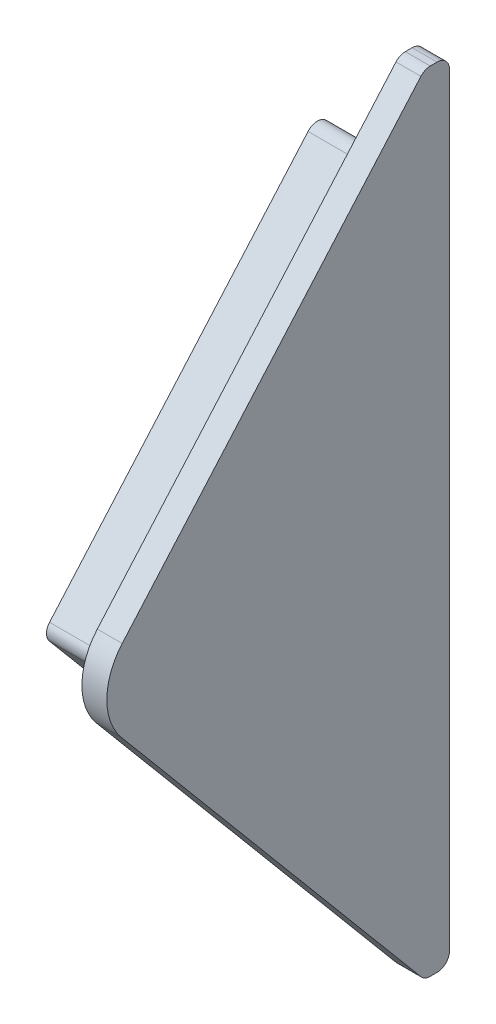
ISO-10303-21;
HEADER;
FILE_DESCRIPTION(('STEP AP214'),'2;1');
FILE_NAME('part.step','',(''),(''),'','','');
FILE_SCHEMA(('AUTOMOTIVE_DESIGN { 1 0 10303 214 1 1 1 1 }'));
ENDSEC;
DATA;
#1=APPLICATION_CONTEXT('core data for automotive mechanical design processes');
#2=APPLICATION_PROTOCOL_DEFINITION('international standard','automotive_design',2000,#1);
#3=PRODUCT_CONTEXT('',#1,'mechanical');
#4=PRODUCT('Part','Part','',(#3));
#5=PRODUCT_RELATED_PRODUCT_CATEGORY('part','',(#4));
#6=PRODUCT_DEFINITION_FORMATION('','',#4);
#7=PRODUCT_DEFINITION_CONTEXT('part definition',#1,'design');
#8=PRODUCT_DEFINITION('design','',#6,#7);
#9=PRODUCT_DEFINITION_SHAPE('','',#8);
#10=(LENGTH_UNIT() NAMED_UNIT(*) SI_UNIT(.MILLI.,.METRE.));
#11=(NAMED_UNIT(*) PLANE_ANGLE_UNIT() SI_UNIT($,.RADIAN.));
#12=(NAMED_UNIT(*) SI_UNIT($,.STERADIAN.) SOLID_ANGLE_UNIT());
#13=UNCERTAINTY_MEASURE_WITH_UNIT(LENGTH_MEASURE(1.E-05),#10,'distance_accuracy_value','');
#14=(GEOMETRIC_REPRESENTATION_CONTEXT(3) GLOBAL_UNCERTAINTY_ASSIGNED_CONTEXT((#13)) GLOBAL_UNIT_ASSIGNED_CONTEXT((#10,
#11,#12)) REPRESENTATION_CONTEXT('',''));
#15=CARTESIAN_POINT('',(0.,0.,0.));
#16=DIRECTION('',(0.,0.,1.));
#17=DIRECTION('',(1.,0.,0.));
#18=AXIS2_PLACEMENT_3D('',#15,#16,#17);
#19=CARTESIAN_POINT('',(-5.,1.67124778518499,-1.99171555210935));
#20=DIRECTION('',(0.,-0.642787609686535,0.766044443118982));
#21=DIRECTION('',(0.,-0.766044443118982,-0.642787609686535));
#22=AXIS2_PLACEMENT_3D('',#19,#20,#21);
#23=PLANE('',#22);
#24=DIRECTION('',(0.,-0.766044443118982,-0.642787609686535));
#25=VECTOR('',#24,1.);
#26=CARTESIAN_POINT('',(-5.,1.67124778518499,-1.99171555210935));
#27=LINE('',#26,#25);
#28=CARTESIAN_POINT('',(-5.,31.5898475942284,23.1129705129993));
#29=VERTEX_POINT('',#28);
#30=CARTESIAN_POINT('',(-5.,6.86462391516174,2.36604444311898));
#31=VERTEX_POINT('',#30);
#32=EDGE_CURVE('E210',#29,#31,#27,.T.);
#33=ORIENTED_EDGE('',*,*,#32,.T.);
#34=DIRECTION('',(1.,0.,0.));
#35=VECTOR('',#34,1.);
#36=CARTESIAN_POINT('',(-5.,6.86462391516174,2.36604444311898));
#37=LINE('',#36,#35);
#38=CARTESIAN_POINT('',(0.,6.86462391516174,2.36604444311898));
#39=VERTEX_POINT('',#38);
#40=EDGE_CURVE('E241',#31,#39,#37,.T.);
#41=ORIENTED_EDGE('',*,*,#40,.T.);
#42=DIRECTION('',(0.,-0.766044443118982,-0.642787609686535));
#43=VECTOR('',#42,1.);
#44=CARTESIAN_POINT('',(0.,1.67124778518499,-1.99171555210935));
#45=LINE('',#44,#43);
#46=CARTESIAN_POINT('',(0.,31.5898475942284,23.1129705129993));
#47=VERTEX_POINT('',#46);
#48=EDGE_CURVE('E222',#47,#39,#45,.T.);
#49=ORIENTED_EDGE('',*,*,#48,.F.);
#50=DIRECTION('',(1.,0.,0.));
#51=VECTOR('',#50,1.);
#52=CARTESIAN_POINT('',(-5.,31.5898475942284,23.1129705129993));
#53=LINE('',#52,#51);
#54=EDGE_CURVE('E238',#47,#29,#53,.F.);
#55=ORIENTED_EDGE('',*,*,#54,.T.);
#56=EDGE_LOOP('',(#33,#41,#49,#55));
#57=FACE_BOUND('',#56,.T.);
#58=ADVANCED_FACE('F47',(#57),#23,.T.);
#59=CARTESIAN_POINT('',(-5.,25.6847211739515,29.3960849054822));
#60=DIRECTION('',(0.,0.657969745780061,0.753044363658691));
#61=DIRECTION('',(0.,-0.753044363658691,0.657969745780061));
#62=AXIS2_PLACEMENT_3D('',#59,#60,#61);
#63=PLANE('',#62);
#64=DIRECTION('',(0.,-0.753044363658691,0.657969745780061));
#65=VECTOR('',#64,1.);
#66=CARTESIAN_POINT('',(0.,25.6847211739515,29.3960849054822));
#67=LINE('',#66,#65);
#68=CARTESIAN_POINT('',(0.,56.6353984457008,2.35304436365869));
#69=VERTEX_POINT('',#68);
#70=CARTESIAN_POINT('',(0.,32.890604949695,23.0999704335391));
#71=VERTEX_POINT('',#70);
#72=EDGE_CURVE('E215',#69,#71,#67,.T.);
#73=ORIENTED_EDGE('',*,*,#72,.F.);
#74=DIRECTION('',(1.,0.,0.));
#75=VECTOR('',#74,1.);
#76=CARTESIAN_POINT('',(-5.,56.6353984457008,2.35304436365869));
#77=LINE('',#76,#75);
#78=CARTESIAN_POINT('',(-5.,56.6353984457008,2.35304436365869));
#79=VERTEX_POINT('',#78);
#80=EDGE_CURVE('E265',#69,#79,#77,.F.);
#81=ORIENTED_EDGE('',*,*,#80,.T.);
#82=DIRECTION('',(0.,-0.753044363658691,0.657969745780061));
#83=VECTOR('',#82,1.);
#84=CARTESIAN_POINT('',(-5.,25.6847211739515,29.3960849054822));
#85=LINE('',#84,#83);
#86=CARTESIAN_POINT('',(-5.,32.890604949695,23.0999704335391));
#87=VERTEX_POINT('',#86);
#88=EDGE_CURVE('E183',#79,#87,#85,.T.);
#89=ORIENTED_EDGE('',*,*,#88,.T.);
#90=DIRECTION('',(1.,0.,0.));
#91=VECTOR('',#90,1.);
#92=CARTESIAN_POINT('',(-5.,32.890604949695,23.0999704335391));
#93=LINE('',#92,#91);
#94=EDGE_CURVE('E261',#87,#71,#93,.T.);
#95=ORIENTED_EDGE('',*,*,#94,.T.);
#96=EDGE_LOOP('',(#73,#81,#89,#95));
#97=FACE_BOUND('',#96,.T.);
#98=ADVANCED_FACE('F366',(#97),#63,.T.);
#99=CARTESIAN_POINT('',(-5.,0.,0.6));
#100=DIRECTION('',(0.,0.,-1.));
#101=DIRECTION('',(-1.,0.,0.));
#102=AXIS2_PLACEMENT_3D('',#99,#100,#101);
#103=PLANE('',#102);
#104=DIRECTION('',(0.,1.,0.));
#105=VECTOR('',#104,1.);
#106=CARTESIAN_POINT('',(0.,0.,0.6));
#107=LINE('',#106,#105);
#108=CARTESIAN_POINT('',(0.,7.50741152484828,0.6));
#109=VERTEX_POINT('',#108);
#110=CARTESIAN_POINT('',(0.,55.9774286999208,0.6));
#111=VERTEX_POINT('',#110);
#112=EDGE_CURVE('E226',#109,#111,#107,.T.);
#113=ORIENTED_EDGE('',*,*,#112,.F.);
#114=DIRECTION('',(1.,0.,0.));
#115=VECTOR('',#114,1.);
#116=CARTESIAN_POINT('',(-5.,7.50741152484828,0.6));
#117=LINE('',#116,#115);
#118=CARTESIAN_POINT('',(-5.,7.50741152484828,0.6));
#119=VERTEX_POINT('',#118);
#120=EDGE_CURVE('E249',#109,#119,#117,.F.);
#121=ORIENTED_EDGE('',*,*,#120,.T.);
#122=DIRECTION('',(0.,1.,0.));
#123=VECTOR('',#122,1.);
#124=CARTESIAN_POINT('',(-5.,0.,0.6));
#125=LINE('',#124,#123);
#126=CARTESIAN_POINT('',(-5.,55.9774286999208,0.6));
#127=VERTEX_POINT('',#126);
#128=EDGE_CURVE('E214',#119,#127,#125,.T.);
#129=ORIENTED_EDGE('',*,*,#128,.T.);
#130=DIRECTION('',(1.,0.,0.));
#131=VECTOR('',#130,1.);
#132=CARTESIAN_POINT('',(-5.,55.9774286999208,0.6));
#133=LINE('',#132,#131);
#134=EDGE_CURVE('E245',#127,#111,#133,.T.);
#135=ORIENTED_EDGE('',*,*,#134,.T.);
#136=EDGE_LOOP('',(#113,#121,#129,#135));
#137=FACE_BOUND('',#136,.T.);
#138=ADVANCED_FACE('F373',(#137),#103,.T.);
#139=CARTESIAN_POINT('',(-5.,0.,0.));
#140=DIRECTION('',(1.,0.,0.));
#141=DIRECTION('',(0.,0.,-1.));
#142=AXIS2_PLACEMENT_3D('',#139,#140,#141);
#143=PLANE('',#142);
#144=ORIENTED_EDGE('',*,*,#128,.F.);
#145=CARTESIAN_POINT('',(-5.,7.50741152484828,1.6));
#146=DIRECTION('',(1.,0.,0.));
#147=DIRECTION('',(0.,0.,-1.));
#148=AXIS2_PLACEMENT_3D('',#145,#146,#147);
#149=CIRCLE('',#148,1.);
#150=EDGE_CURVE('E258',#119,#31,#149,.F.);
#151=ORIENTED_EDGE('',*,*,#150,.T.);
#152=ORIENTED_EDGE('',*,*,#32,.F.);
#153=CARTESIAN_POINT('',(-5.,32.232635203915,22.3469260698804));
#154=DIRECTION('',(1.,0.,0.));
#155=DIRECTION('',(0.,0.,-1.));
#156=AXIS2_PLACEMENT_3D('',#153,#154,#155);
#157=CIRCLE('',#156,1.);
#158=EDGE_CURVE('E252',#29,#87,#157,.F.);
#159=ORIENTED_EDGE('',*,*,#158,.T.);
#160=ORIENTED_EDGE('',*,*,#88,.F.);
#161=CARTESIAN_POINT('',(-5.,55.9774286999208,1.6));
#162=DIRECTION('',(1.,0.,0.));
#163=DIRECTION('',(0.,0.,-1.));
#164=AXIS2_PLACEMENT_3D('',#161,#162,#163);
#165=CIRCLE('',#164,1.);
#166=EDGE_CURVE('E255',#79,#127,#165,.F.);
#167=ORIENTED_EDGE('',*,*,#166,.T.);
#168=EDGE_LOOP('',(#144,#151,#152,#159,#160,#167));
#169=FACE_BOUND('',#168,.T.);
#170=ADVANCED_FACE('F483',(#169),#143,.F.);
#171=CARTESIAN_POINT('',(0.,0.,0.));
#172=DIRECTION('',(1.,0.,0.));
#173=DIRECTION('',(0.,0.,-1.));
#174=AXIS2_PLACEMENT_3D('',#171,#172,#173);
#175=PLANE('',#174);
#176=DIRECTION('',(0.,0.,-1.));
#177=VECTOR('',#176,1.);
#178=CARTESIAN_POINT('',(0.,0.,0.));
#179=LINE('',#178,#177);
#180=CARTESIAN_POINT('',(0.,0.,-0.466307658155014));
#181=VERTEX_POINT('',#180);
#182=CARTESIAN_POINT('',(0.,0.,-1.00000000000001));
#183=VERTEX_POINT('',#182);
#184=EDGE_CURVE('E190',#181,#183,#179,.T.);
#185=ORIENTED_EDGE('',*,*,#184,.F.);
#186=CARTESIAN_POINT('',(0.,0.999999999999989,-0.466307658155007));
#187=DIRECTION('',(1.,0.,0.));
#188=DIRECTION('',(0.,0.,-1.));
#189=AXIS2_PLACEMENT_3D('',#186,#187,#188);
#190=CIRCLE('',#189,1.);
#191=CARTESIAN_POINT('',(0.,0.357212390313454,0.299736784963975));
#192=VERTEX_POINT('',#191);
#193=EDGE_CURVE('E188',#181,#192,#190,.F.);
#194=ORIENTED_EDGE('',*,*,#193,.T.);
#195=DIRECTION('',(0.,-0.766044443118982,-0.642787609686535));
#196=VECTOR('',#195,1.);
#197=CARTESIAN_POINT('',(0.,0.,0.));
#198=LINE('',#197,#196);
#199=CARTESIAN_POINT('',(0.,29.0002775125603,24.3341221648279));
#200=VERTEX_POINT('',#199);
#201=EDGE_CURVE('E178',#200,#192,#198,.T.);
#202=ORIENTED_EDGE('',*,*,#201,.F.);
#203=CARTESIAN_POINT('',(0.,32.214215560993,20.5038999492329));
#204=DIRECTION('',(1.,0.,0.));
#205=DIRECTION('',(0.,0.,-1.));
#206=AXIS2_PLACEMENT_3D('',#203,#204,#205);
#207=CIRCLE('',#206,5.);
#208=CARTESIAN_POINT('',(0.,35.5040642898933,24.2691217675264));
#209=VERTEX_POINT('',#208);
#210=EDGE_CURVE('E162',#200,#209,#207,.F.);
#211=ORIENTED_EDGE('',*,*,#210,.T.);
#212=DIRECTION('',(0.,-0.753044363658691,0.657969745780061));
#213=VECTOR('',#212,1.);
#214=CARTESIAN_POINT('',(0.,27.3954425129796,31.3540002509948));
#215=LINE('',#214,#213);
#216=CARTESIAN_POINT('',(0.,62.9379697457801,0.298847677877558));
#217=VERTEX_POINT('',#216);
#218=EDGE_CURVE('E207',#217,#209,#215,.T.);
#219=ORIENTED_EDGE('',*,*,#218,.F.);
#220=CARTESIAN_POINT('',(0.,62.28,-0.454196685781134));
#221=DIRECTION('',(1.,0.,0.));
#222=DIRECTION('',(0.,0.,-1.));
#223=AXIS2_PLACEMENT_3D('',#220,#221,#222);
#224=CIRCLE('',#223,1.);
#225=CARTESIAN_POINT('',(0.,63.28,-0.454196685781134));
#226=VERTEX_POINT('',#225);
#227=EDGE_CURVE('E287',#217,#226,#224,.F.);
#228=ORIENTED_EDGE('',*,*,#227,.T.);
#229=DIRECTION('',(0.,0.,-1.));
#230=VECTOR('',#229,1.);
#231=CARTESIAN_POINT('',(0.,63.28,0.));
#232=LINE('',#231,#230);
#233=CARTESIAN_POINT('',(0.,63.28,-1.));
#234=VERTEX_POINT('',#233);
#235=EDGE_CURVE('E203',#226,#234,#232,.T.);
#236=ORIENTED_EDGE('',*,*,#235,.T.);
#237=CARTESIAN_POINT('',(0.,62.28,-1.));
#238=DIRECTION('',(1.,0.,0.));
#239=DIRECTION('',(0.,0.,-1.));
#240=AXIS2_PLACEMENT_3D('',#237,#238,#239);
#241=CIRCLE('',#240,1.);
#242=CARTESIAN_POINT('',(0.,62.28,-2.));
#243=VERTEX_POINT('',#242);
#244=EDGE_CURVE('E284',#234,#243,#241,.F.);
#245=ORIENTED_EDGE('',*,*,#244,.T.);
#246=DIRECTION('',(0.,1.,0.));
#247=VECTOR('',#246,1.);
#248=CARTESIAN_POINT('',(0.,0.,-2.));
#249=LINE('',#248,#247);
#250=CARTESIAN_POINT('',(0.,0.999999999999993,-2.));
#251=VERTEX_POINT('',#250);
#252=EDGE_CURVE('E194',#251,#243,#249,.T.);
#253=ORIENTED_EDGE('',*,*,#252,.F.);
#254=CARTESIAN_POINT('',(0.,0.999999999999993,-1.));
#255=DIRECTION('',(1.,0.,0.));
#256=DIRECTION('',(0.,0.,-1.));
#257=AXIS2_PLACEMENT_3D('',#254,#255,#256);
#258=CIRCLE('',#257,1.);
#259=EDGE_CURVE('E290',#251,#183,#258,.F.);
#260=ORIENTED_EDGE('',*,*,#259,.T.);
#261=EDGE_LOOP('',(#185,#194,#202,#211,#219,#228,#236,#245,#253,#260));
#262=FACE_BOUND('',#261,.T.);
#263=ORIENTED_EDGE('',*,*,#112,.T.);
#264=CARTESIAN_POINT('',(0.,55.9774286999208,1.6));
#265=DIRECTION('',(1.,0.,0.));
#266=DIRECTION('',(0.,0.,-1.));
#267=AXIS2_PLACEMENT_3D('',#264,#265,#266);
#268=CIRCLE('',#267,1.);
#269=EDGE_CURVE('E271',#111,#69,#268,.T.);
#270=ORIENTED_EDGE('',*,*,#269,.T.);
#271=ORIENTED_EDGE('',*,*,#72,.T.);
#272=CARTESIAN_POINT('',(0.,32.232635203915,22.3469260698804));
#273=DIRECTION('',(1.,0.,0.));
#274=DIRECTION('',(0.,0.,-1.));
#275=AXIS2_PLACEMENT_3D('',#272,#273,#274);
#276=CIRCLE('',#275,1.);
#277=EDGE_CURVE('E274',#71,#47,#276,.T.);
#278=ORIENTED_EDGE('',*,*,#277,.T.);
#279=ORIENTED_EDGE('',*,*,#48,.T.);
#280=CARTESIAN_POINT('',(0.,7.50741152484828,1.6));
#281=DIRECTION('',(1.,0.,0.));
#282=DIRECTION('',(0.,0.,-1.));
#283=AXIS2_PLACEMENT_3D('',#280,#281,#282);
#284=CIRCLE('',#283,1.);
#285=EDGE_CURVE('E268',#39,#109,#284,.T.);
#286=ORIENTED_EDGE('',*,*,#285,.T.);
#287=EDGE_LOOP('',(#263,#270,#271,#278,#279,#286));
#288=FACE_BOUND('',#287,.T.);
#289=ADVANCED_FACE('F186',(#262,#288),#175,.F.);
#290=CARTESIAN_POINT('',(2.,0.,0.));
#291=DIRECTION('',(0.,0.642787609686535,-0.766044443118982));
#292=DIRECTION('',(0.,0.766044443118982,0.642787609686535));
#293=AXIS2_PLACEMENT_3D('',#290,#291,#292);
#294=PLANE('',#293);
#295=ORIENTED_EDGE('',*,*,#201,.T.);
#296=DIRECTION('',(-1.,0.,0.));
#297=VECTOR('',#296,1.);
#298=CARTESIAN_POINT('',(2.,0.357212390313454,0.299736784963975));
#299=LINE('',#298,#297);
#300=CARTESIAN_POINT('',(2.,0.357212390313454,0.299736784963975));
#301=VERTEX_POINT('',#300);
#302=EDGE_CURVE('E295',#192,#301,#299,.F.);
#303=ORIENTED_EDGE('',*,*,#302,.T.);
#304=DIRECTION('',(0.,-0.766044443118982,-0.642787609686535));
#305=VECTOR('',#304,1.);
#306=CARTESIAN_POINT('',(2.,0.,0.));
#307=LINE('',#306,#305);
#308=CARTESIAN_POINT('',(2.,29.0002775125603,24.3341221648279));
#309=VERTEX_POINT('',#308);
#310=EDGE_CURVE('E181',#309,#301,#307,.T.);
#311=ORIENTED_EDGE('',*,*,#310,.F.);
#312=DIRECTION('',(-1.,0.,0.));
#313=VECTOR('',#312,1.);
#314=CARTESIAN_POINT('',(2.,29.0002775125603,24.3341221648279));
#315=LINE('',#314,#313);
#316=EDGE_CURVE('E166',#309,#200,#315,.T.);
#317=ORIENTED_EDGE('',*,*,#316,.T.);
#318=EDGE_LOOP('',(#295,#303,#311,#317));
#319=FACE_BOUND('',#318,.T.);
#320=ADVANCED_FACE('F177',(#319),#294,.F.);
#321=CARTESIAN_POINT('',(2.,0.,0.));
#322=DIRECTION('',(0.,1.,0.));
#323=DIRECTION('',(0.,0.,1.));
#324=AXIS2_PLACEMENT_3D('',#321,#322,#323);
#325=PLANE('',#324);
#326=DIRECTION('',(0.,0.,-1.));
#327=VECTOR('',#326,1.);
#328=CARTESIAN_POINT('',(2.,0.,0.));
#329=LINE('',#328,#327);
#330=CARTESIAN_POINT('',(2.,0.,-0.466307658155014));
#331=VERTEX_POINT('',#330);
#332=CARTESIAN_POINT('',(2.,0.,-1.00000000000001));
#333=VERTEX_POINT('',#332);
#334=EDGE_CURVE('E337',#331,#333,#329,.T.);
#335=ORIENTED_EDGE('',*,*,#334,.F.);
#336=DIRECTION('',(-1.,0.,0.));
#337=VECTOR('',#336,1.);
#338=CARTESIAN_POINT('',(2.,0.,-0.466307658155014));
#339=LINE('',#338,#337);
#340=EDGE_CURVE('E280',#331,#181,#339,.T.);
#341=ORIENTED_EDGE('',*,*,#340,.T.);
#342=ORIENTED_EDGE('',*,*,#184,.T.);
#343=DIRECTION('',(-1.,0.,0.));
#344=VECTOR('',#343,1.);
#345=CARTESIAN_POINT('',(2.,0.,-1.00000000000001));
#346=LINE('',#345,#344);
#347=EDGE_CURVE('E277',#183,#333,#346,.F.);
#348=ORIENTED_EDGE('',*,*,#347,.T.);
#349=EDGE_LOOP('',(#335,#341,#342,#348));
#350=FACE_BOUND('',#349,.T.);
#351=ADVANCED_FACE('F351',(#350),#325,.F.);
#352=CARTESIAN_POINT('',(2.,0.,-2.));
#353=DIRECTION('',(0.,0.,1.));
#354=DIRECTION('',(1.,0.,0.));
#355=AXIS2_PLACEMENT_3D('',#352,#353,#354);
#356=PLANE('',#355);
#357=DIRECTION('',(0.,1.,0.));
#358=VECTOR('',#357,1.);
#359=CARTESIAN_POINT('',(2.,0.,-2.));
#360=LINE('',#359,#358);
#361=CARTESIAN_POINT('',(2.,0.999999999999993,-2.));
#362=VERTEX_POINT('',#361);
#363=CARTESIAN_POINT('',(2.,62.28,-2.));
#364=VERTEX_POINT('',#363);
#365=EDGE_CURVE('E335',#362,#364,#360,.T.);
#366=ORIENTED_EDGE('',*,*,#365,.F.);
#367=DIRECTION('',(-1.,0.,0.));
#368=VECTOR('',#367,1.);
#369=CARTESIAN_POINT('',(2.,0.999999999999993,-2.));
#370=LINE('',#369,#368);
#371=EDGE_CURVE('E312',#362,#251,#370,.T.);
#372=ORIENTED_EDGE('',*,*,#371,.T.);
#373=ORIENTED_EDGE('',*,*,#252,.T.);
#374=DIRECTION('',(-1.,0.,0.));
#375=VECTOR('',#374,1.);
#376=CARTESIAN_POINT('',(2.,62.28,-2.));
#377=LINE('',#376,#375);
#378=EDGE_CURVE('E309',#243,#364,#377,.F.);
#379=ORIENTED_EDGE('',*,*,#378,.T.);
#380=EDGE_LOOP('',(#366,#372,#373,#379));
#381=FACE_BOUND('',#380,.T.);
#382=ADVANCED_FACE('F359',(#381),#356,.F.);
#383=CARTESIAN_POINT('',(2.,63.28,0.));
#384=DIRECTION('',(0.,1.,0.));
#385=DIRECTION('',(0.,0.,1.));
#386=AXIS2_PLACEMENT_3D('',#383,#384,#385);
#387=PLANE('',#386);
#388=ORIENTED_EDGE('',*,*,#235,.F.);
#389=DIRECTION('',(-1.,0.,0.));
#390=VECTOR('',#389,1.);
#391=CARTESIAN_POINT('',(2.,63.28,-0.454196685781134));
#392=LINE('',#391,#390);
#393=CARTESIAN_POINT('',(2.,63.28,-0.454196685781134));
#394=VERTEX_POINT('',#393);
#395=EDGE_CURVE('E11',#226,#394,#392,.F.);
#396=ORIENTED_EDGE('',*,*,#395,.T.);
#397=DIRECTION('',(0.,0.,-1.));
#398=VECTOR('',#397,1.);
#399=CARTESIAN_POINT('',(2.,63.28,0.));
#400=LINE('',#399,#398);
#401=CARTESIAN_POINT('',(2.,63.28,-1.));
#402=VERTEX_POINT('',#401);
#403=EDGE_CURVE('E323',#394,#402,#400,.T.);
#404=ORIENTED_EDGE('',*,*,#403,.T.);
#405=DIRECTION('',(-1.,0.,0.));
#406=VECTOR('',#405,1.);
#407=CARTESIAN_POINT('',(0.,63.28,-1.));
#408=LINE('',#407,#406);
#409=EDGE_CURVE('E56',#402,#234,#408,.T.);
#410=ORIENTED_EDGE('',*,*,#409,.T.);
#411=EDGE_LOOP('',(#388,#396,#404,#410));
#412=FACE_BOUND('',#411,.T.);
#413=ADVANCED_FACE('F322',(#412),#387,.T.);
#414=CARTESIAN_POINT('',(2.,27.3954425129796,31.3540002509948));
#415=DIRECTION('',(0.,-0.657969745780061,-0.753044363658691));
#416=DIRECTION('',(0.,0.753044363658691,-0.657969745780061));
#417=AXIS2_PLACEMENT_3D('',#414,#415,#416);
#418=PLANE('',#417);
#419=DIRECTION('',(0.,-0.753044363658691,0.657969745780061));
#420=VECTOR('',#419,1.);
#421=CARTESIAN_POINT('',(2.,27.3954425129796,31.3540002509948));
#422=LINE('',#421,#420);
#423=CARTESIAN_POINT('',(2.,62.9379697457801,0.298847677877558));
#424=VERTEX_POINT('',#423);
#425=CARTESIAN_POINT('',(2.,35.5040642898933,24.2691217675264));
#426=VERTEX_POINT('',#425);
#427=EDGE_CURVE('E197',#424,#426,#422,.T.);
#428=ORIENTED_EDGE('',*,*,#427,.F.);
#429=DIRECTION('',(-1.,0.,0.));
#430=VECTOR('',#429,1.);
#431=CARTESIAN_POINT('',(0.,62.9379697457801,0.298847677877555));
#432=LINE('',#431,#430);
#433=EDGE_CURVE('E316',#424,#217,#432,.T.);
#434=ORIENTED_EDGE('',*,*,#433,.T.);
#435=ORIENTED_EDGE('',*,*,#218,.T.);
#436=DIRECTION('',(-1.,0.,0.));
#437=VECTOR('',#436,1.);
#438=CARTESIAN_POINT('',(2.,35.5040642898933,24.2691217675264));
#439=LINE('',#438,#437);
#440=EDGE_CURVE('E168',#209,#426,#439,.F.);
#441=ORIENTED_EDGE('',*,*,#440,.T.);
#442=EDGE_LOOP('',(#428,#434,#435,#441));
#443=FACE_BOUND('',#442,.T.);
#444=ADVANCED_FACE('F332',(#443),#418,.F.);
#445=CARTESIAN_POINT('',(2.,0.,0.));
#446=DIRECTION('',(1.,0.,0.));
#447=DIRECTION('',(0.,0.,-1.));
#448=AXIS2_PLACEMENT_3D('',#445,#446,#447);
#449=PLANE('',#448);
#450=ORIENTED_EDGE('',*,*,#310,.T.);
#451=CARTESIAN_POINT('',(2.,0.999999999999989,-0.466307658155007));
#452=DIRECTION('',(1.,0.,0.));
#453=DIRECTION('',(0.,0.,-1.));
#454=AXIS2_PLACEMENT_3D('',#451,#452,#453);
#455=CIRCLE('',#454,1.);
#456=EDGE_CURVE('E306',#301,#331,#455,.T.);
#457=ORIENTED_EDGE('',*,*,#456,.T.);
#458=ORIENTED_EDGE('',*,*,#334,.T.);
#459=CARTESIAN_POINT('',(2.,0.999999999999993,-1.));
#460=DIRECTION('',(1.,0.,0.));
#461=DIRECTION('',(0.,0.,-1.));
#462=AXIS2_PLACEMENT_3D('',#459,#460,#461);
#463=CIRCLE('',#462,1.);
#464=EDGE_CURVE('E303',#333,#362,#463,.T.);
#465=ORIENTED_EDGE('',*,*,#464,.T.);
#466=ORIENTED_EDGE('',*,*,#365,.T.);
#467=CARTESIAN_POINT('',(2.,62.28,-1.));
#468=DIRECTION('',(1.,0.,0.));
#469=DIRECTION('',(0.,0.,-1.));
#470=AXIS2_PLACEMENT_3D('',#467,#468,#469);
#471=CIRCLE('',#470,1.);
#472=EDGE_CURVE('E63',#364,#402,#471,.T.);
#473=ORIENTED_EDGE('',*,*,#472,.T.);
#474=ORIENTED_EDGE('',*,*,#403,.F.);
#475=CARTESIAN_POINT('',(2.,62.28,-0.454196685781134));
#476=DIRECTION('',(1.,0.,0.));
#477=DIRECTION('',(0.,0.,-1.));
#478=AXIS2_PLACEMENT_3D('',#475,#476,#477);
#479=CIRCLE('',#478,1.);
#480=EDGE_CURVE('E300',#394,#424,#479,.T.);
#481=ORIENTED_EDGE('',*,*,#480,.T.);
#482=ORIENTED_EDGE('',*,*,#427,.T.);
#483=CARTESIAN_POINT('',(2.,32.214215560993,20.5038999492329));
#484=DIRECTION('',(1.,0.,0.));
#485=DIRECTION('',(0.,0.,-1.));
#486=AXIS2_PLACEMENT_3D('',#483,#484,#485);
#487=CIRCLE('',#486,5.);
#488=EDGE_CURVE('E235',#426,#309,#487,.T.);
#489=ORIENTED_EDGE('',*,*,#488,.T.);
#490=EDGE_LOOP('',(#450,#457,#458,#465,#466,#473,#474,#481,#482,#489));
#491=FACE_BOUND('',#490,.T.);
#492=ADVANCED_FACE('F345',(#491),#449,.T.);
#493=CARTESIAN_POINT('',(2.,32.214215560993,20.5038999492329));
#494=DIRECTION('',(-1.,0.,0.));
#495=DIRECTION('',(0.,0.,1.));
#496=AXIS2_PLACEMENT_3D('',#493,#494,#495);
#497=CYLINDRICAL_SURFACE('',#496,5.);
#498=ORIENTED_EDGE('',*,*,#488,.F.);
#499=ORIENTED_EDGE('',*,*,#440,.F.);
#500=ORIENTED_EDGE('',*,*,#210,.F.);
#501=ORIENTED_EDGE('',*,*,#316,.F.);
#502=EDGE_LOOP('',(#498,#499,#500,#501));
#503=FACE_BOUND('',#502,.T.);
#504=ADVANCED_FACE('F165',(#503),#497,.T.);
#505=CARTESIAN_POINT('',(-5.,7.50741152484828,1.6));
#506=DIRECTION('',(1.,0.,0.));
#507=DIRECTION('',(0.,0.,-1.));
#508=AXIS2_PLACEMENT_3D('',#505,#506,#507);
#509=CYLINDRICAL_SURFACE('',#508,1.);
#510=ORIENTED_EDGE('',*,*,#150,.F.);
#511=ORIENTED_EDGE('',*,*,#120,.F.);
#512=ORIENTED_EDGE('',*,*,#285,.F.);
#513=ORIENTED_EDGE('',*,*,#40,.F.);
#514=EDGE_LOOP('',(#510,#511,#512,#513));
#515=FACE_BOUND('',#514,.T.);
#516=ADVANCED_FACE('F379',(#515),#509,.T.);
#517=CARTESIAN_POINT('',(-5.,55.9774286999208,1.6));
#518=DIRECTION('',(1.,0.,0.));
#519=DIRECTION('',(0.,0.,-1.));
#520=AXIS2_PLACEMENT_3D('',#517,#518,#519);
#521=CYLINDRICAL_SURFACE('',#520,1.);
#522=ORIENTED_EDGE('',*,*,#166,.F.);
#523=ORIENTED_EDGE('',*,*,#80,.F.);
#524=ORIENTED_EDGE('',*,*,#269,.F.);
#525=ORIENTED_EDGE('',*,*,#134,.F.);
#526=EDGE_LOOP('',(#522,#523,#524,#525));
#527=FACE_BOUND('',#526,.T.);
#528=ADVANCED_FACE('F382',(#527),#521,.T.);
#529=CARTESIAN_POINT('',(-5.,32.232635203915,22.3469260698804));
#530=DIRECTION('',(1.,0.,0.));
#531=DIRECTION('',(0.,0.,-1.));
#532=AXIS2_PLACEMENT_3D('',#529,#530,#531);
#533=CYLINDRICAL_SURFACE('',#532,1.);
#534=ORIENTED_EDGE('',*,*,#158,.F.);
#535=ORIENTED_EDGE('',*,*,#54,.F.);
#536=ORIENTED_EDGE('',*,*,#277,.F.);
#537=ORIENTED_EDGE('',*,*,#94,.F.);
#538=EDGE_LOOP('',(#534,#535,#536,#537));
#539=FACE_BOUND('',#538,.T.);
#540=ADVANCED_FACE('F386',(#539),#533,.T.);
#541=CARTESIAN_POINT('',(2.,0.999999999999989,-0.466307658155007));
#542=DIRECTION('',(-1.,0.,0.));
#543=DIRECTION('',(0.,0.,1.));
#544=AXIS2_PLACEMENT_3D('',#541,#542,#543);
#545=CYLINDRICAL_SURFACE('',#544,1.);
#546=ORIENTED_EDGE('',*,*,#456,.F.);
#547=ORIENTED_EDGE('',*,*,#302,.F.);
#548=ORIENTED_EDGE('',*,*,#193,.F.);
#549=ORIENTED_EDGE('',*,*,#340,.F.);
#550=EDGE_LOOP('',(#546,#547,#548,#549));
#551=FACE_BOUND('',#550,.T.);
#552=ADVANCED_FACE('F349',(#551),#545,.T.);
#553=CARTESIAN_POINT('',(2.,0.999999999999993,-1.));
#554=DIRECTION('',(-1.,0.,0.));
#555=DIRECTION('',(0.,0.,1.));
#556=AXIS2_PLACEMENT_3D('',#553,#554,#555);
#557=CYLINDRICAL_SURFACE('',#556,1.);
#558=ORIENTED_EDGE('',*,*,#464,.F.);
#559=ORIENTED_EDGE('',*,*,#347,.F.);
#560=ORIENTED_EDGE('',*,*,#259,.F.);
#561=ORIENTED_EDGE('',*,*,#371,.F.);
#562=EDGE_LOOP('',(#558,#559,#560,#561));
#563=FACE_BOUND('',#562,.T.);
#564=ADVANCED_FACE('F356',(#563),#557,.T.);
#565=CARTESIAN_POINT('',(2.,62.28,-0.454196685781134));
#566=DIRECTION('',(1.,0.,0.));
#567=DIRECTION('',(0.,0.,-1.));
#568=AXIS2_PLACEMENT_3D('',#565,#566,#567);
#569=CYLINDRICAL_SURFACE('',#568,1.);
#570=ORIENTED_EDGE('',*,*,#480,.F.);
#571=ORIENTED_EDGE('',*,*,#395,.F.);
#572=ORIENTED_EDGE('',*,*,#227,.F.);
#573=ORIENTED_EDGE('',*,*,#433,.F.);
#574=EDGE_LOOP('',(#570,#571,#572,#573));
#575=FACE_BOUND('',#574,.T.);
#576=ADVANCED_FACE('F329',(#575),#569,.T.);
#577=CARTESIAN_POINT('',(2.,62.28,-1.));
#578=DIRECTION('',(1.,0.,0.));
#579=DIRECTION('',(0.,0.,-1.));
#580=AXIS2_PLACEMENT_3D('',#577,#578,#579);
#581=CYLINDRICAL_SURFACE('',#580,1.);
#582=ORIENTED_EDGE('',*,*,#472,.F.);
#583=ORIENTED_EDGE('',*,*,#378,.F.);
#584=ORIENTED_EDGE('',*,*,#244,.F.);
#585=ORIENTED_EDGE('',*,*,#409,.F.);
#586=EDGE_LOOP('',(#582,#583,#584,#585));
#587=FACE_BOUND('',#586,.T.);
#588=ADVANCED_FACE('F49',(#587),#581,.T.);
#589=CLOSED_SHELL('',(#58,#98,#138,#170,#289,#320,#351,#382,#413,#444,#492,#504,#516,#528,#540,
#552,#564,#576,#588));
#590=MANIFOLD_SOLID_BREP('B2',#589);
#591=ADVANCED_BREP_SHAPE_REPRESENTATION('',(#18,#590),#14);
#592=SHAPE_DEFINITION_REPRESENTATION(#9,#591);
ENDSEC;
END-ISO-10303-21;
